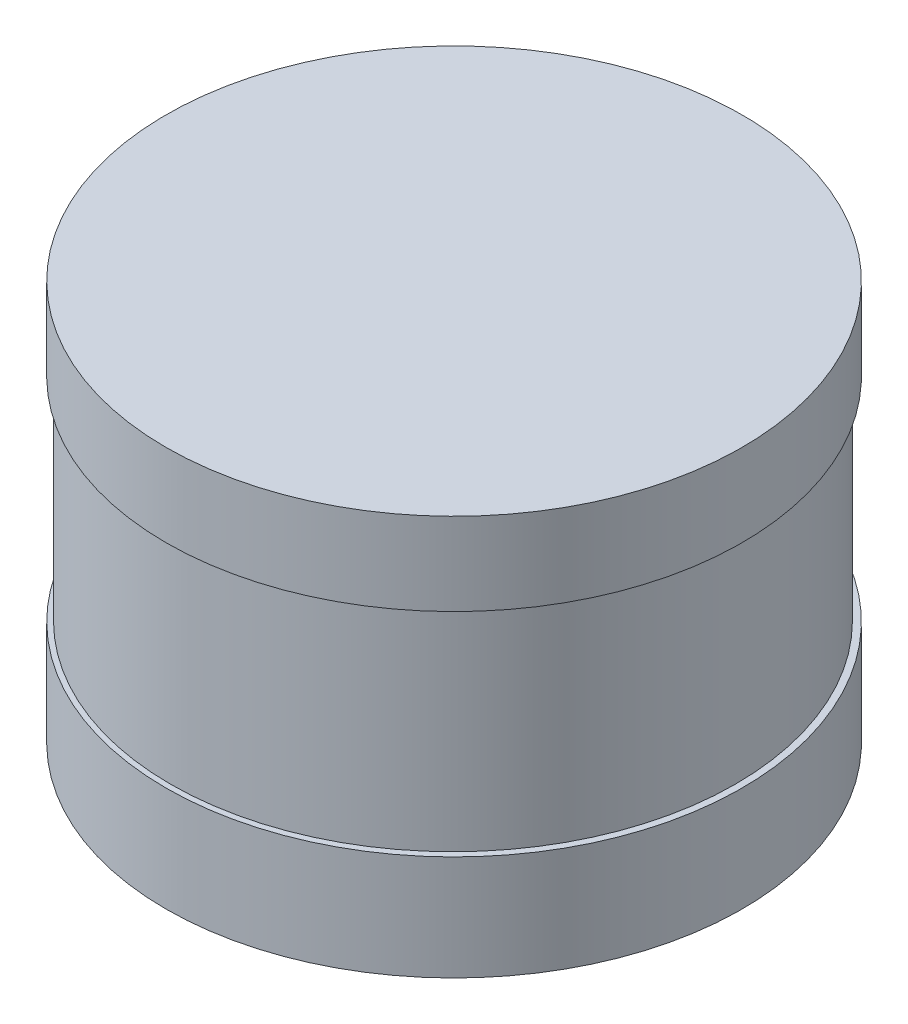
ISO-10303-21;
HEADER;
FILE_DESCRIPTION(('STEP AP214'),'2;1');
FILE_NAME('part.step','',(''),(''),'','','');
FILE_SCHEMA(('AUTOMOTIVE_DESIGN { 1 0 10303 214 1 1 1 1 }'));
ENDSEC;
DATA;
#1=APPLICATION_CONTEXT('core data for automotive mechanical design processes');
#2=APPLICATION_PROTOCOL_DEFINITION('international standard','automotive_design',2000,#1);
#3=PRODUCT_CONTEXT('',#1,'mechanical');
#4=PRODUCT('Part','Part','',(#3));
#5=PRODUCT_RELATED_PRODUCT_CATEGORY('part','',(#4));
#6=PRODUCT_DEFINITION_FORMATION('','',#4);
#7=PRODUCT_DEFINITION_CONTEXT('part definition',#1,'design');
#8=PRODUCT_DEFINITION('design','',#6,#7);
#9=PRODUCT_DEFINITION_SHAPE('','',#8);
#10=(LENGTH_UNIT() NAMED_UNIT(*) SI_UNIT(.MILLI.,.METRE.));
#11=(NAMED_UNIT(*) PLANE_ANGLE_UNIT() SI_UNIT($,.RADIAN.));
#12=(NAMED_UNIT(*) SI_UNIT($,.STERADIAN.) SOLID_ANGLE_UNIT());
#13=UNCERTAINTY_MEASURE_WITH_UNIT(LENGTH_MEASURE(1.E-05),#10,'distance_accuracy_value','');
#14=(GEOMETRIC_REPRESENTATION_CONTEXT(3) GLOBAL_UNCERTAINTY_ASSIGNED_CONTEXT((#13)) GLOBAL_UNIT_ASSIGNED_CONTEXT((#10,
#11,#12)) REPRESENTATION_CONTEXT('',''));
#15=CARTESIAN_POINT('',(0.,0.,0.));
#16=DIRECTION('',(0.,0.,1.));
#17=DIRECTION('',(1.,0.,0.));
#18=AXIS2_PLACEMENT_3D('',#15,#16,#17);
#19=CARTESIAN_POINT('',(0.,71.7,0.));
#20=DIRECTION('',(0.,-1.,0.));
#21=DIRECTION('',(0.,0.,-1.));
#22=AXIS2_PLACEMENT_3D('',#19,#20,#21);
#23=CYLINDRICAL_SURFACE('',#22,51.65);
#24=CARTESIAN_POINT('',(0.,71.7,0.));
#25=DIRECTION('',(0.,1.,0.));
#26=DIRECTION('',(0.,0.,1.));
#27=AXIS2_PLACEMENT_3D('',#24,#25,#26);
#28=CIRCLE('',#27,51.65);
#29=CARTESIAN_POINT('',(0.,71.7,51.65));
#30=VERTEX_POINT('',#29);
#31=EDGE_CURVE('E11',#30,#30,#28,.T.);
#32=ORIENTED_EDGE('',*,*,#31,.F.);
#33=EDGE_LOOP('',(#32));
#34=FACE_BOUND('',#33,.T.);
#35=CARTESIAN_POINT('',(0.,56.9,0.));
#36=DIRECTION('',(0.,1.,0.));
#37=DIRECTION('',(0.,0.,1.));
#38=AXIS2_PLACEMENT_3D('',#35,#36,#37);
#39=CIRCLE('',#38,51.65);
#40=CARTESIAN_POINT('',(0.,56.9,51.65));
#41=VERTEX_POINT('',#40);
#42=EDGE_CURVE('E44',#41,#41,#39,.T.);
#43=ORIENTED_EDGE('',*,*,#42,.T.);
#44=EDGE_LOOP('',(#43));
#45=FACE_BOUND('',#44,.T.);
#46=ADVANCED_FACE('F41',(#34,#45),#23,.T.);
#47=CARTESIAN_POINT('',(0.,71.7,0.));
#48=DIRECTION('',(0.,1.,0.));
#49=DIRECTION('',(0.,0.,1.));
#50=AXIS2_PLACEMENT_3D('',#47,#48,#49);
#51=PLANE('',#50);
#52=ORIENTED_EDGE('',*,*,#31,.T.);
#53=EDGE_LOOP('',(#52));
#54=FACE_BOUND('',#53,.T.);
#55=ADVANCED_FACE('F56',(#54),#51,.T.);
#56=CARTESIAN_POINT('',(0.,56.9,0.));
#57=DIRECTION('',(0.,1.,0.));
#58=DIRECTION('',(0.,0.,1.));
#59=AXIS2_PLACEMENT_3D('',#56,#57,#58);
#60=PLANE('',#59);
#61=ORIENTED_EDGE('',*,*,#42,.F.);
#62=EDGE_LOOP('',(#61));
#63=FACE_BOUND('',#62,.T.);
#64=ADVANCED_FACE('F54',(#63),#60,.F.);
#65=CLOSED_SHELL('',(#46,#55,#64));
#66=MANIFOLD_SOLID_BREP('B2',#65);
#67=CARTESIAN_POINT('',(-0.199999999999999,56.9,0.));
#68=DIRECTION('',(0.,-1.,0.));
#69=DIRECTION('',(0.,0.,-1.));
#70=AXIS2_PLACEMENT_3D('',#67,#68,#69);
#71=CYLINDRICAL_SURFACE('',#70,50.65);
#72=CARTESIAN_POINT('',(-0.199999999999999,56.9,0.));
#73=DIRECTION('',(0.,1.,0.));
#74=DIRECTION('',(0.,0.,1.));
#75=AXIS2_PLACEMENT_3D('',#72,#73,#74);
#76=CIRCLE('',#75,50.65);
#77=CARTESIAN_POINT('',(-0.199999999999999,56.9,-50.65));
#78=VERTEX_POINT('',#77);
#79=EDGE_CURVE('E40',#78,#78,#76,.T.);
#80=CARTESIAN_POINT('',(-0.199999999999999,18.8,0.));
#81=DIRECTION('',(0.,1.,0.));
#82=DIRECTION('',(0.,0.,1.));
#83=AXIS2_PLACEMENT_3D('',#80,#81,#82);
#84=CIRCLE('',#83,50.65);
#85=CARTESIAN_POINT('',(-0.199999999999999,18.8,-50.65));
#86=VERTEX_POINT('',#85);
#87=EDGE_CURVE('E91',#86,#86,#84,.T.);
#88=CARTESIAN_POINT('',(-0.199999999999999,56.9,-50.65));
#89=CARTESIAN_POINT('',(-0.199999999999999,56.503125,-50.65));
#90=CARTESIAN_POINT('',(-0.199999999999999,56.10625,-50.65));
#91=CARTESIAN_POINT('',(-0.199999999999999,55.3125,-50.65));
#92=CARTESIAN_POINT('',(-0.199999999999999,54.915625,-50.65));
#93=CARTESIAN_POINT('',(-0.199999999999999,54.121875,-50.65));
#94=CARTESIAN_POINT('',(-0.199999999999999,53.725,-50.65));
#95=CARTESIAN_POINT('',(-0.199999999999999,52.93125,-50.65));
#96=CARTESIAN_POINT('',(-0.199999999999999,52.534375,-50.65));
#97=CARTESIAN_POINT('',(-0.199999999999999,51.740625,-50.65));
#98=CARTESIAN_POINT('',(-0.199999999999999,51.34375,-50.65));
#99=CARTESIAN_POINT('',(-0.199999999999999,50.55,-50.65));
#100=CARTESIAN_POINT('',(-0.199999999999999,50.153125,-50.65));
#101=CARTESIAN_POINT('',(-0.199999999999999,49.359375,-50.65));
#102=CARTESIAN_POINT('',(-0.199999999999999,48.9625,-50.65));
#103=CARTESIAN_POINT('',(-0.199999999999999,48.16875,-50.65));
#104=CARTESIAN_POINT('',(-0.199999999999999,47.771875,-50.65));
#105=CARTESIAN_POINT('',(-0.199999999999999,46.978125,-50.65));
#106=CARTESIAN_POINT('',(-0.199999999999999,46.58125,-50.65));
#107=CARTESIAN_POINT('',(-0.199999999999999,45.7875,-50.65));
#108=CARTESIAN_POINT('',(-0.199999999999999,45.390625,-50.65));
#109=CARTESIAN_POINT('',(-0.199999999999999,44.596875,-50.65));
#110=CARTESIAN_POINT('',(-0.199999999999999,44.2,-50.65));
#111=CARTESIAN_POINT('',(-0.199999999999999,43.40625,-50.65));
#112=CARTESIAN_POINT('',(-0.199999999999999,43.009375,-50.65));
#113=CARTESIAN_POINT('',(-0.199999999999999,42.215625,-50.65));
#114=CARTESIAN_POINT('',(-0.199999999999999,41.81875,-50.65));
#115=CARTESIAN_POINT('',(-0.199999999999999,41.025,-50.65));
#116=CARTESIAN_POINT('',(-0.199999999999999,40.628125,-50.65));
#117=CARTESIAN_POINT('',(-0.199999999999999,39.834375,-50.65));
#118=CARTESIAN_POINT('',(-0.199999999999999,39.4375,-50.65));
#119=CARTESIAN_POINT('',(-0.199999999999999,38.64375,-50.65));
#120=CARTESIAN_POINT('',(-0.199999999999999,38.246875,-50.65));
#121=CARTESIAN_POINT('',(-0.199999999999999,37.453125,-50.65));
#122=CARTESIAN_POINT('',(-0.199999999999999,37.05625,-50.65));
#123=CARTESIAN_POINT('',(-0.199999999999999,36.2625,-50.65));
#124=CARTESIAN_POINT('',(-0.199999999999999,35.865625,-50.65));
#125=CARTESIAN_POINT('',(-0.199999999999999,35.071875,-50.65));
#126=CARTESIAN_POINT('',(-0.199999999999999,34.675,-50.65));
#127=CARTESIAN_POINT('',(-0.199999999999999,33.88125,-50.65));
#128=CARTESIAN_POINT('',(-0.199999999999999,33.484375,-50.65));
#129=CARTESIAN_POINT('',(-0.199999999999999,32.690625,-50.65));
#130=CARTESIAN_POINT('',(-0.199999999999999,32.29375,-50.65));
#131=CARTESIAN_POINT('',(-0.199999999999999,31.5,-50.65));
#132=CARTESIAN_POINT('',(-0.199999999999999,31.103125,-50.65));
#133=CARTESIAN_POINT('',(-0.199999999999999,30.309375,-50.65));
#134=CARTESIAN_POINT('',(-0.199999999999999,29.9125,-50.65));
#135=CARTESIAN_POINT('',(-0.199999999999999,29.11875,-50.65));
#136=CARTESIAN_POINT('',(-0.199999999999999,28.721875,-50.65));
#137=CARTESIAN_POINT('',(-0.199999999999999,27.928125,-50.65));
#138=CARTESIAN_POINT('',(-0.199999999999999,27.53125,-50.65));
#139=CARTESIAN_POINT('',(-0.199999999999999,26.7375,-50.65));
#140=CARTESIAN_POINT('',(-0.199999999999999,26.340625,-50.65));
#141=CARTESIAN_POINT('',(-0.199999999999999,25.546875,-50.65));
#142=CARTESIAN_POINT('',(-0.199999999999999,25.15,-50.65));
#143=CARTESIAN_POINT('',(-0.199999999999999,24.35625,-50.65));
#144=CARTESIAN_POINT('',(-0.199999999999999,23.959375,-50.65));
#145=CARTESIAN_POINT('',(-0.199999999999999,23.165625,-50.65));
#146=CARTESIAN_POINT('',(-0.199999999999999,22.76875,-50.65));
#147=CARTESIAN_POINT('',(-0.199999999999999,21.975,-50.65));
#148=CARTESIAN_POINT('',(-0.199999999999999,21.578125,-50.65));
#149=CARTESIAN_POINT('',(-0.199999999999999,20.784375,-50.65));
#150=CARTESIAN_POINT('',(-0.199999999999999,20.3875,-50.65));
#151=CARTESIAN_POINT('',(-0.199999999999999,19.59375,-50.65));
#152=CARTESIAN_POINT('',(-0.199999999999999,19.196875,-50.65));
#153=CARTESIAN_POINT('',(-0.199999999999999,18.8,-50.65));
#154=B_SPLINE_CURVE_WITH_KNOTS('',3,(#88,#89,#90,#91,#92,#93,#94,#95,#96,#97,#98,#99,#100,#101,
#102,#103,#104,#105,#106,#107,#108,#109,#110,#111,#112,#113,#114,#115,#116,#117,#118,#119,#120,
#121,#122,#123,#124,#125,#126,#127,#128,#129,#130,#131,#132,#133,#134,#135,#136,#137,#138,#139,
#140,#141,#142,#143,#144,#145,#146,#147,#148,#149,#150,#151,#152,#153),.UNSPECIFIED.,.F.,.F.,(4,
2,2,2,2,2,2,2,2,2,2,2,2,2,2,2,2,2,2,2,2,2,2,2,2,2,2,2,2,2,2,2,4),(0.,1.19062499999999,
2.38124999999999,3.571875,4.7625,5.953125,7.14375,8.334375,9.525,10.715625,11.90625,13.096875,
14.2875,15.478125,16.66875,17.859375,19.05,20.240625,21.43125,22.621875,23.8125,25.003125,
26.19375,27.384375,28.575,29.765625,30.95625,32.146875,33.3375,34.528125,35.71875,36.909375,
38.1),.UNSPECIFIED.);
#155=EDGE_CURVE('BSEAM88',#78,#86,#154,.T.);
#156=ORIENTED_EDGE('',*,*,#79,.F.);
#157=ORIENTED_EDGE('',*,*,#87,.T.);
#158=ORIENTED_EDGE('',*,*,#155,.T.);
#159=ORIENTED_EDGE('',*,*,#155,.F.);
#160=EDGE_LOOP('',(#156,#158,#157,#159));
#161=FACE_BOUND('',#160,.T.);
#162=ADVANCED_FACE('F88',(#161),#71,.T.);
#163=CARTESIAN_POINT('',(-0.199999999999999,56.9,0.));
#164=DIRECTION('',(0.,1.,0.));
#165=DIRECTION('',(0.,0.,1.));
#166=AXIS2_PLACEMENT_3D('',#163,#164,#165);
#167=PLANE('',#166);
#168=ORIENTED_EDGE('',*,*,#79,.T.);
#169=EDGE_LOOP('',(#168));
#170=FACE_BOUND('',#169,.T.);
#171=ADVANCED_FACE('F103',(#170),#167,.T.);
#172=CARTESIAN_POINT('',(-0.199999999999999,18.8,0.));
#173=DIRECTION('',(0.,1.,0.));
#174=DIRECTION('',(0.,0.,1.));
#175=AXIS2_PLACEMENT_3D('',#172,#173,#174);
#176=PLANE('',#175);
#177=ORIENTED_EDGE('',*,*,#87,.F.);
#178=EDGE_LOOP('',(#177));
#179=FACE_BOUND('',#178,.T.);
#180=ADVANCED_FACE('F101',(#179),#176,.F.);
#181=CLOSED_SHELL('',(#162,#171,#180));
#182=MANIFOLD_SOLID_BREP('B6',#181);
#183=CARTESIAN_POINT('',(0.,18.8,0.));
#184=DIRECTION('',(0.,-1.,0.));
#185=DIRECTION('',(0.,0.,-1.));
#186=AXIS2_PLACEMENT_3D('',#183,#184,#185);
#187=CYLINDRICAL_SURFACE('',#186,51.65);
#188=CARTESIAN_POINT('',(0.,18.8,0.));
#189=DIRECTION('',(0.,1.,0.));
#190=DIRECTION('',(0.,0.,1.));
#191=AXIS2_PLACEMENT_3D('',#188,#189,#190);
#192=CIRCLE('',#191,51.65);
#193=CARTESIAN_POINT('',(0.,18.8,51.65));
#194=VERTEX_POINT('',#193);
#195=EDGE_CURVE('E87',#194,#194,#192,.T.);
#196=ORIENTED_EDGE('',*,*,#195,.F.);
#197=EDGE_LOOP('',(#196));
#198=FACE_BOUND('',#197,.T.);
#199=CARTESIAN_POINT('',(0.,0.,0.));
#200=DIRECTION('',(0.,1.,0.));
#201=DIRECTION('',(0.,0.,1.));
#202=AXIS2_PLACEMENT_3D('',#199,#200,#201);
#203=CIRCLE('',#202,51.65);
#204=CARTESIAN_POINT('',(0.,0.,51.65));
#205=VERTEX_POINT('',#204);
#206=EDGE_CURVE('E131',#205,#205,#203,.T.);
#207=ORIENTED_EDGE('',*,*,#206,.T.);
#208=EDGE_LOOP('',(#207));
#209=FACE_BOUND('',#208,.T.);
#210=ADVANCED_FACE('F128',(#198,#209),#187,.T.);
#211=CARTESIAN_POINT('',(0.,18.8,0.));
#212=DIRECTION('',(0.,1.,0.));
#213=DIRECTION('',(0.,0.,1.));
#214=AXIS2_PLACEMENT_3D('',#211,#212,#213);
#215=PLANE('',#214);
#216=ORIENTED_EDGE('',*,*,#195,.T.);
#217=EDGE_LOOP('',(#216));
#218=FACE_BOUND('',#217,.T.);
#219=ADVANCED_FACE('F171',(#218),#215,.T.);
#220=CARTESIAN_POINT('',(0.,0.,0.));
#221=DIRECTION('',(0.,1.,0.));
#222=DIRECTION('',(0.,0.,1.));
#223=AXIS2_PLACEMENT_3D('',#220,#221,#222);
#224=PLANE('',#223);
#225=CARTESIAN_POINT('',(0.,0.,0.));
#226=DIRECTION('',(0.,-1.,0.));
#227=DIRECTION('',(0.,0.,-1.));
#228=AXIS2_PLACEMENT_3D('',#225,#226,#227);
#229=CIRCLE('',#228,3.175);
#230=CARTESIAN_POINT('',(0.,0.,-3.175));
#231=VERTEX_POINT('',#230);
#232=EDGE_CURVE('E152',#231,#231,#229,.T.);
#233=ORIENTED_EDGE('',*,*,#232,.F.);
#234=EDGE_LOOP('',(#233));
#235=FACE_BOUND('',#234,.T.);
#236=CARTESIAN_POINT('',(0.,0.,44.45));
#237=DIRECTION('',(0.,-1.,0.));
#238=DIRECTION('',(0.,0.,-1.));
#239=AXIS2_PLACEMENT_3D('',#236,#237,#238);
#240=CIRCLE('',#239,2.032);
#241=CARTESIAN_POINT('',(0.,0.,42.418));
#242=VERTEX_POINT('',#241);
#243=EDGE_CURVE('E146',#242,#242,#240,.T.);
#244=ORIENTED_EDGE('',*,*,#243,.F.);
#245=EDGE_LOOP('',(#244));
#246=FACE_BOUND('',#245,.T.);
#247=CARTESIAN_POINT('',(0.,0.,-44.45));
#248=DIRECTION('',(0.,-1.,0.));
#249=DIRECTION('',(0.,0.,-1.));
#250=AXIS2_PLACEMENT_3D('',#247,#248,#249);
#251=CIRCLE('',#250,2.032);
#252=CARTESIAN_POINT('',(0.,0.,-46.482));
#253=VERTEX_POINT('',#252);
#254=EDGE_CURVE('E140',#253,#253,#251,.T.);
#255=ORIENTED_EDGE('',*,*,#254,.F.);
#256=EDGE_LOOP('',(#255));
#257=FACE_BOUND('',#256,.T.);
#258=ORIENTED_EDGE('',*,*,#206,.F.);
#259=EDGE_LOOP('',(#258));
#260=FACE_BOUND('',#259,.T.);
#261=ADVANCED_FACE('F167',(#235,#246,#257,#260),#224,.F.);
#262=CARTESIAN_POINT('',(0.,5.5,-44.45));
#263=DIRECTION('',(0.,-1.,0.));
#264=DIRECTION('',(0.,0.,-1.));
#265=AXIS2_PLACEMENT_3D('',#262,#263,#264);
#266=CYLINDRICAL_SURFACE('',#265,2.032);
#267=CARTESIAN_POINT('',(0.,5.5,-44.45));
#268=DIRECTION('',(0.,-1.,0.));
#269=DIRECTION('',(0.,0.,-1.));
#270=AXIS2_PLACEMENT_3D('',#267,#268,#269);
#271=CIRCLE('',#270,2.032);
#272=CARTESIAN_POINT('',(0.,5.5,-46.482));
#273=VERTEX_POINT('',#272);
#274=EDGE_CURVE('E138',#273,#273,#271,.T.);
#275=ORIENTED_EDGE('',*,*,#274,.F.);
#276=EDGE_LOOP('',(#275));
#277=FACE_BOUND('',#276,.T.);
#278=ORIENTED_EDGE('',*,*,#254,.T.);
#279=EDGE_LOOP('',(#278));
#280=FACE_BOUND('',#279,.T.);
#281=ADVANCED_FACE('F170',(#277,#280),#266,.F.);
#282=CARTESIAN_POINT('',(0.,5.5,-44.45));
#283=DIRECTION('',(0.,-1.,0.));
#284=DIRECTION('',(0.,0.,-1.));
#285=AXIS2_PLACEMENT_3D('',#282,#283,#284);
#286=PLANE('',#285);
#287=ORIENTED_EDGE('',*,*,#274,.T.);
#288=EDGE_LOOP('',(#287));
#289=FACE_BOUND('',#288,.T.);
#290=ADVANCED_FACE('F189',(#289),#286,.T.);
#291=CARTESIAN_POINT('',(0.,5.5,44.45));
#292=DIRECTION('',(0.,-1.,0.));
#293=DIRECTION('',(0.,0.,-1.));
#294=AXIS2_PLACEMENT_3D('',#291,#292,#293);
#295=CYLINDRICAL_SURFACE('',#294,2.032);
#296=CARTESIAN_POINT('',(0.,5.5,44.45));
#297=DIRECTION('',(0.,-1.,0.));
#298=DIRECTION('',(0.,0.,-1.));
#299=AXIS2_PLACEMENT_3D('',#296,#297,#298);
#300=CIRCLE('',#299,2.032);
#301=CARTESIAN_POINT('',(0.,5.5,42.418));
#302=VERTEX_POINT('',#301);
#303=EDGE_CURVE('E143',#302,#302,#300,.T.);
#304=ORIENTED_EDGE('',*,*,#303,.F.);
#305=EDGE_LOOP('',(#304));
#306=FACE_BOUND('',#305,.T.);
#307=ORIENTED_EDGE('',*,*,#243,.T.);
#308=EDGE_LOOP('',(#307));
#309=FACE_BOUND('',#308,.T.);
#310=ADVANCED_FACE('F193',(#306,#309),#295,.F.);
#311=CARTESIAN_POINT('',(0.,5.5,44.45));
#312=DIRECTION('',(0.,-1.,0.));
#313=DIRECTION('',(0.,0.,-1.));
#314=AXIS2_PLACEMENT_3D('',#311,#312,#313);
#315=PLANE('',#314);
#316=ORIENTED_EDGE('',*,*,#303,.T.);
#317=EDGE_LOOP('',(#316));
#318=FACE_BOUND('',#317,.T.);
#319=ADVANCED_FACE('F163',(#318),#315,.T.);
#320=CARTESIAN_POINT('',(0.,7.1,0.));
#321=DIRECTION('',(0.,-1.,0.));
#322=DIRECTION('',(0.,0.,-1.));
#323=AXIS2_PLACEMENT_3D('',#320,#321,#322);
#324=CYLINDRICAL_SURFACE('',#323,3.175);
#325=CARTESIAN_POINT('',(0.,7.1,0.));
#326=DIRECTION('',(0.,-1.,0.));
#327=DIRECTION('',(0.,0.,-1.));
#328=AXIS2_PLACEMENT_3D('',#325,#326,#327);
#329=CIRCLE('',#328,3.175);
#330=CARTESIAN_POINT('',(0.,7.1,-3.175));
#331=VERTEX_POINT('',#330);
#332=EDGE_CURVE('E149',#331,#331,#329,.T.);
#333=ORIENTED_EDGE('',*,*,#332,.F.);
#334=EDGE_LOOP('',(#333));
#335=FACE_BOUND('',#334,.T.);
#336=ORIENTED_EDGE('',*,*,#232,.T.);
#337=EDGE_LOOP('',(#336));
#338=FACE_BOUND('',#337,.T.);
#339=ADVANCED_FACE('F160',(#335,#338),#324,.F.);
#340=CARTESIAN_POINT('',(0.,7.1,0.));
#341=DIRECTION('',(0.,-1.,0.));
#342=DIRECTION('',(0.,0.,-1.));
#343=AXIS2_PLACEMENT_3D('',#340,#341,#342);
#344=PLANE('',#343);
#345=ORIENTED_EDGE('',*,*,#332,.T.);
#346=EDGE_LOOP('',(#345));
#347=FACE_BOUND('',#346,.T.);
#348=ADVANCED_FACE('F158',(#347),#344,.T.);
#349=CLOSED_SHELL('',(#210,#219,#261,#281,#290,#310,#319,#339,#348));
#350=MANIFOLD_SOLID_BREP('B35',#349);
#351=ADVANCED_BREP_SHAPE_REPRESENTATION('',(#18,#66,#182,#350),#14);
#352=SHAPE_DEFINITION_REPRESENTATION(#9,#351);
ENDSEC;
END-ISO-10303-21;
